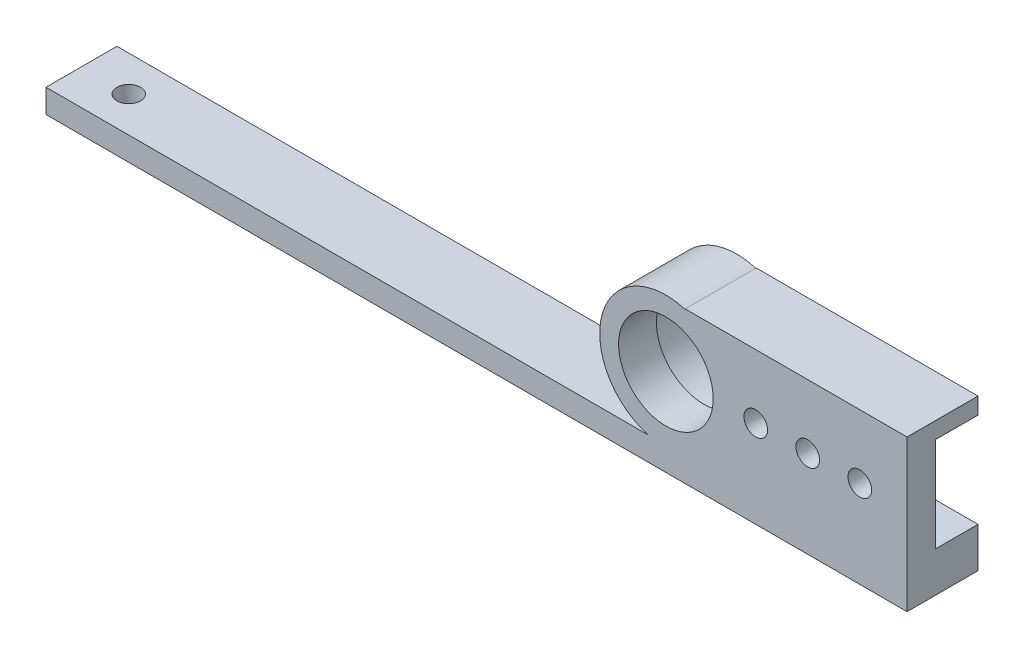
ISO-10303-21;
HEADER;
FILE_DESCRIPTION(('STEP AP214'),'2;1');
FILE_NAME('part.step','',(''),(''),'','','');
FILE_SCHEMA(('AUTOMOTIVE_DESIGN { 1 0 10303 214 1 1 1 1 }'));
ENDSEC;
DATA;
#1=APPLICATION_CONTEXT('core data for automotive mechanical design processes');
#2=APPLICATION_PROTOCOL_DEFINITION('international standard','automotive_design',2000,#1);
#3=PRODUCT_CONTEXT('',#1,'mechanical');
#4=PRODUCT('Part','Part','',(#3));
#5=PRODUCT_RELATED_PRODUCT_CATEGORY('part','',(#4));
#6=PRODUCT_DEFINITION_FORMATION('','',#4);
#7=PRODUCT_DEFINITION_CONTEXT('part definition',#1,'design');
#8=PRODUCT_DEFINITION('design','',#6,#7);
#9=PRODUCT_DEFINITION_SHAPE('','',#8);
#10=(LENGTH_UNIT() NAMED_UNIT(*) SI_UNIT(.MILLI.,.METRE.));
#11=(NAMED_UNIT(*) PLANE_ANGLE_UNIT() SI_UNIT($,.RADIAN.));
#12=(NAMED_UNIT(*) SI_UNIT($,.STERADIAN.) SOLID_ANGLE_UNIT());
#13=UNCERTAINTY_MEASURE_WITH_UNIT(LENGTH_MEASURE(1.E-05),#10,'distance_accuracy_value','');
#14=(GEOMETRIC_REPRESENTATION_CONTEXT(3) GLOBAL_UNCERTAINTY_ASSIGNED_CONTEXT((#13)) GLOBAL_UNIT_ASSIGNED_CONTEXT((#10,
#11,#12)) REPRESENTATION_CONTEXT('',''));
#15=CARTESIAN_POINT('',(0.,0.,0.));
#16=DIRECTION('',(0.,0.,1.));
#17=DIRECTION('',(1.,0.,0.));
#18=AXIS2_PLACEMENT_3D('',#15,#16,#17);
#19=CARTESIAN_POINT('',(-31.,0.,-9.));
#20=DIRECTION('',(0.,0.,1.));
#21=DIRECTION('',(1.,0.,0.));
#22=AXIS2_PLACEMENT_3D('',#19,#20,#21);
#23=CYLINDRICAL_SURFACE('',#22,14.);
#24=DIRECTION('',(0.,0.,1.));
#25=VECTOR('',#24,1.);
#26=CARTESIAN_POINT('',(-34.7080992435478,-13.5,-9.));
#27=LINE('',#26,#25);
#28=CARTESIAN_POINT('',(-34.7080992435478,-13.5,6.));
#29=VERTEX_POINT('',#28);
#30=CARTESIAN_POINT('',(-34.7080992435478,-13.5,-9.));
#31=VERTEX_POINT('',#30);
#32=EDGE_CURVE('E162',#29,#31,#27,.F.);
#33=ORIENTED_EDGE('',*,*,#32,.F.);
#34=CARTESIAN_POINT('',(-31.,0.,6.));
#35=DIRECTION('',(0.,0.,1.));
#36=DIRECTION('',(1.,0.,0.));
#37=AXIS2_PLACEMENT_3D('',#34,#35,#36);
#38=CIRCLE('',#37,14.);
#39=CARTESIAN_POINT('',(-26.8939671408107,13.3843376436512,6.));
#40=VERTEX_POINT('',#39);
#41=EDGE_CURVE('E181',#40,#29,#38,.T.);
#42=ORIENTED_EDGE('',*,*,#41,.F.);
#43=DIRECTION('',(0.,0.,1.));
#44=VECTOR('',#43,1.);
#45=CARTESIAN_POINT('',(-26.8939671408107,13.3843376436512,-9.));
#46=LINE('',#45,#44);
#47=CARTESIAN_POINT('',(-26.8939671408107,13.3843376436512,-9.));
#48=VERTEX_POINT('',#47);
#49=EDGE_CURVE('E226',#48,#40,#46,.T.);
#50=ORIENTED_EDGE('',*,*,#49,.F.);
#51=CARTESIAN_POINT('',(-31.,0.,-9.));
#52=DIRECTION('',(0.,0.,1.));
#53=DIRECTION('',(1.,0.,0.));
#54=AXIS2_PLACEMENT_3D('',#51,#52,#53);
#55=CIRCLE('',#54,14.);
#56=EDGE_CURVE('E197',#48,#31,#55,.T.);
#57=ORIENTED_EDGE('',*,*,#56,.T.);
#58=EDGE_LOOP('',(#33,#42,#50,#57));
#59=FACE_BOUND('',#58,.T.);
#60=ADVANCED_FACE('F45',(#59),#23,.T.);
#61=CARTESIAN_POINT('',(-31.,0.,-9.));
#62=DIRECTION('',(0.,0.,1.));
#63=DIRECTION('',(1.,0.,0.));
#64=AXIS2_PLACEMENT_3D('',#61,#62,#63);
#65=CYLINDRICAL_SURFACE('',#64,11.);
#66=CARTESIAN_POINT('',(-31.,0.,-9.));
#67=DIRECTION('',(0.,0.,1.));
#68=DIRECTION('',(1.,0.,0.));
#69=AXIS2_PLACEMENT_3D('',#66,#67,#68);
#70=CIRCLE('',#69,11.);
#71=CARTESIAN_POINT('',(-20.,0.,-9.));
#72=VERTEX_POINT('',#71);
#73=EDGE_CURVE('E177',#72,#72,#70,.T.);
#74=ORIENTED_EDGE('',*,*,#73,.F.);
#75=EDGE_LOOP('',(#74));
#76=FACE_BOUND('',#75,.T.);
#77=CARTESIAN_POINT('',(-31.,0.,-2.));
#78=DIRECTION('',(0.,0.,1.));
#79=DIRECTION('',(1.,0.,0.));
#80=AXIS2_PLACEMENT_3D('',#77,#78,#79);
#81=CIRCLE('',#80,11.);
#82=CARTESIAN_POINT('',(-20.,0.,-2.));
#83=VERTEX_POINT('',#82);
#84=EDGE_CURVE('E11',#83,#83,#81,.F.);
#85=ORIENTED_EDGE('',*,*,#84,.F.);
#86=EDGE_LOOP('',(#85));
#87=FACE_BOUND('',#86,.T.);
#88=ADVANCED_FACE('F323',(#76,#87),#65,.F.);
#89=CARTESIAN_POINT('',(20.,-10.,6.));
#90=DIRECTION('',(-1.,0.,0.));
#91=DIRECTION('',(0.,0.,1.));
#92=AXIS2_PLACEMENT_3D('',#89,#90,#91);
#93=PLANE('',#92);
#94=DIRECTION('',(0.,1.,0.));
#95=VECTOR('',#94,1.);
#96=CARTESIAN_POINT('',(20.,-10.,0.));
#97=LINE('',#96,#95);
#98=CARTESIAN_POINT('',(20.,-10.,0.));
#99=VERTEX_POINT('',#98);
#100=CARTESIAN_POINT('',(20.,10.,0.));
#101=VERTEX_POINT('',#100);
#102=EDGE_CURVE('E268',#99,#101,#97,.T.);
#103=ORIENTED_EDGE('',*,*,#102,.T.);
#104=DIRECTION('',(0.,0.,1.));
#105=VECTOR('',#104,1.);
#106=CARTESIAN_POINT('',(20.,10.,-9.));
#107=LINE('',#106,#105);
#108=CARTESIAN_POINT('',(20.,10.,-9.));
#109=VERTEX_POINT('',#108);
#110=EDGE_CURVE('E233',#109,#101,#107,.T.);
#111=ORIENTED_EDGE('',*,*,#110,.F.);
#112=DIRECTION('',(0.,-1.,0.));
#113=VECTOR('',#112,1.);
#114=CARTESIAN_POINT('',(20.,0.,-9.));
#115=LINE('',#114,#113);
#116=CARTESIAN_POINT('',(20.,13.5,-9.));
#117=VERTEX_POINT('',#116);
#118=EDGE_CURVE('E189',#117,#109,#115,.T.);
#119=ORIENTED_EDGE('',*,*,#118,.F.);
#120=DIRECTION('',(0.,0.,1.));
#121=VECTOR('',#120,1.);
#122=CARTESIAN_POINT('',(20.,13.5,-9.));
#123=LINE('',#122,#121);
#124=CARTESIAN_POINT('',(20.,13.5,6.));
#125=VERTEX_POINT('',#124);
#126=EDGE_CURVE('E230',#117,#125,#123,.T.);
#127=ORIENTED_EDGE('',*,*,#126,.T.);
#128=DIRECTION('',(0.,1.,0.));
#129=VECTOR('',#128,1.);
#130=CARTESIAN_POINT('',(20.,-10.,6.));
#131=LINE('',#130,#129);
#132=CARTESIAN_POINT('',(20.,-18.5,6.));
#133=VERTEX_POINT('',#132);
#134=EDGE_CURVE('E259',#133,#125,#131,.T.);
#135=ORIENTED_EDGE('',*,*,#134,.F.);
#136=DIRECTION('',(0.,0.,-1.));
#137=VECTOR('',#136,1.);
#138=CARTESIAN_POINT('',(20.,-18.5,-9.));
#139=LINE('',#138,#137);
#140=CARTESIAN_POINT('',(20.,-18.5,-9.));
#141=VERTEX_POINT('',#140);
#142=EDGE_CURVE('E155',#133,#141,#139,.T.);
#143=ORIENTED_EDGE('',*,*,#142,.T.);
#144=DIRECTION('',(0.,-1.,0.));
#145=VECTOR('',#144,1.);
#146=CARTESIAN_POINT('',(20.,0.,-9.));
#147=LINE('',#146,#145);
#148=CARTESIAN_POINT('',(20.,-10.,-9.));
#149=VERTEX_POINT('',#148);
#150=EDGE_CURVE('E200',#149,#141,#147,.T.);
#151=ORIENTED_EDGE('',*,*,#150,.F.);
#152=DIRECTION('',(0.,0.,1.));
#153=VECTOR('',#152,1.);
#154=CARTESIAN_POINT('',(20.,-10.,-9.));
#155=LINE('',#154,#153);
#156=EDGE_CURVE('E223',#149,#99,#155,.T.);
#157=ORIENTED_EDGE('',*,*,#156,.T.);
#158=EDGE_LOOP('',(#103,#111,#119,#127,#135,#143,#151,#157));
#159=FACE_BOUND('',#158,.T.);
#160=ADVANCED_FACE('F47',(#159),#93,.F.);
#161=CARTESIAN_POINT('',(0.,0.,6.));
#162=DIRECTION('',(0.,0.,1.));
#163=DIRECTION('',(1.,0.,0.));
#164=AXIS2_PLACEMENT_3D('',#161,#162,#163);
#165=PLANE('',#164);
#166=DIRECTION('',(0.,1.,0.));
#167=VECTOR('',#166,1.);
#168=CARTESIAN_POINT('',(-162.091344638161,0.,6.));
#169=LINE('',#168,#167);
#170=CARTESIAN_POINT('',(-162.091344638161,-18.5,6.));
#171=VERTEX_POINT('',#170);
#172=CARTESIAN_POINT('',(-162.091344638161,-13.5,6.));
#173=VERTEX_POINT('',#172);
#174=EDGE_CURVE('E142',#171,#173,#169,.T.);
#175=ORIENTED_EDGE('',*,*,#174,.F.);
#176=DIRECTION('',(1.,0.,0.));
#177=VECTOR('',#176,1.);
#178=CARTESIAN_POINT('',(-180.,-18.5,6.));
#179=LINE('',#178,#177);
#180=EDGE_CURVE('E152',#171,#133,#179,.T.);
#181=ORIENTED_EDGE('',*,*,#180,.T.);
#182=ORIENTED_EDGE('',*,*,#134,.T.);
#183=DIRECTION('',(-1.,0.,0.));
#184=VECTOR('',#183,1.);
#185=CARTESIAN_POINT('',(0.,13.5,6.));
#186=LINE('',#185,#184);
#187=CARTESIAN_POINT('',(-26.8939671408107,13.5,6.));
#188=VERTEX_POINT('',#187);
#189=EDGE_CURVE('E174',#125,#188,#186,.T.);
#190=ORIENTED_EDGE('',*,*,#189,.T.);
#191=DIRECTION('',(0.,1.,0.));
#192=VECTOR('',#191,1.);
#193=CARTESIAN_POINT('',(-26.8939671408107,0.,6.));
#194=LINE('',#193,#192);
#195=EDGE_CURVE('E212',#40,#188,#194,.T.);
#196=ORIENTED_EDGE('',*,*,#195,.F.);
#197=ORIENTED_EDGE('',*,*,#41,.T.);
#198=DIRECTION('',(1.,0.,0.));
#199=VECTOR('',#198,1.);
#200=CARTESIAN_POINT('',(-180.,-13.5,6.));
#201=LINE('',#200,#199);
#202=EDGE_CURVE('E68',#173,#29,#201,.T.);
#203=ORIENTED_EDGE('',*,*,#202,.F.);
#204=EDGE_LOOP('',(#175,#181,#182,#190,#196,#197,#203));
#205=FACE_BOUND('',#204,.T.);
#206=CARTESIAN_POINT('',(10.,0.,6.));
#207=DIRECTION('',(0.,0.,1.));
#208=DIRECTION('',(1.,0.,0.));
#209=AXIS2_PLACEMENT_3D('',#206,#207,#208);
#210=CIRCLE('',#209,2.5);
#211=CARTESIAN_POINT('',(12.5,0.,6.));
#212=VERTEX_POINT('',#211);
#213=EDGE_CURVE('E245',#212,#212,#210,.T.);
#214=ORIENTED_EDGE('',*,*,#213,.F.);
#215=EDGE_LOOP('',(#214));
#216=FACE_BOUND('',#215,.T.);
#217=CARTESIAN_POINT('',(-0.999999999999999,0.,6.));
#218=DIRECTION('',(0.,0.,1.));
#219=DIRECTION('',(1.,0.,0.));
#220=AXIS2_PLACEMENT_3D('',#217,#218,#219);
#221=CIRCLE('',#220,2.5);
#222=CARTESIAN_POINT('',(1.5,0.,6.));
#223=VERTEX_POINT('',#222);
#224=EDGE_CURVE('E248',#223,#223,#221,.T.);
#225=ORIENTED_EDGE('',*,*,#224,.F.);
#226=EDGE_LOOP('',(#225));
#227=FACE_BOUND('',#226,.T.);
#228=CARTESIAN_POINT('',(-12.,-1.53625178909098E-13,6.));
#229=DIRECTION('',(0.,0.,1.));
#230=DIRECTION('',(1.,0.,0.));
#231=AXIS2_PLACEMENT_3D('',#228,#229,#230);
#232=CIRCLE('',#231,2.5);
#233=CARTESIAN_POINT('',(-9.5,-1.53625178909098E-13,6.));
#234=VERTEX_POINT('',#233);
#235=EDGE_CURVE('E254',#234,#234,#232,.T.);
#236=ORIENTED_EDGE('',*,*,#235,.F.);
#237=EDGE_LOOP('',(#236));
#238=FACE_BOUND('',#237,.T.);
#239=CARTESIAN_POINT('',(-31.,0.,6.));
#240=DIRECTION('',(0.,0.,1.));
#241=DIRECTION('',(1.,0.,0.));
#242=AXIS2_PLACEMENT_3D('',#239,#240,#241);
#243=CIRCLE('',#242,10.);
#244=CARTESIAN_POINT('',(-21.,0.,6.));
#245=VERTEX_POINT('',#244);
#246=EDGE_CURVE('E170',#245,#245,#243,.T.);
#247=ORIENTED_EDGE('',*,*,#246,.F.);
#248=EDGE_LOOP('',(#247));
#249=FACE_BOUND('',#248,.T.);
#250=ADVANCED_FACE('F150',(#205,#216,#227,#238,#249),#165,.T.);
#251=CARTESIAN_POINT('',(0.,0.,0.));
#252=DIRECTION('',(0.,0.,1.));
#253=DIRECTION('',(1.,0.,0.));
#254=AXIS2_PLACEMENT_3D('',#251,#252,#253);
#255=PLANE('',#254);
#256=CARTESIAN_POINT('',(10.,0.,0.));
#257=DIRECTION('',(0.,0.,1.));
#258=DIRECTION('',(1.,0.,0.));
#259=AXIS2_PLACEMENT_3D('',#256,#257,#258);
#260=CIRCLE('',#259,2.5);
#261=CARTESIAN_POINT('',(12.5,0.,0.));
#262=VERTEX_POINT('',#261);
#263=EDGE_CURVE('E241',#262,#262,#260,.T.);
#264=ORIENTED_EDGE('',*,*,#263,.T.);
#265=EDGE_LOOP('',(#264));
#266=FACE_BOUND('',#265,.T.);
#267=CARTESIAN_POINT('',(-0.999999999999999,0.,0.));
#268=DIRECTION('',(0.,0.,1.));
#269=DIRECTION('',(1.,0.,0.));
#270=AXIS2_PLACEMENT_3D('',#267,#268,#269);
#271=CIRCLE('',#270,2.5);
#272=CARTESIAN_POINT('',(1.5,0.,0.));
#273=VERTEX_POINT('',#272);
#274=EDGE_CURVE('E251',#273,#273,#271,.T.);
#275=ORIENTED_EDGE('',*,*,#274,.T.);
#276=EDGE_LOOP('',(#275));
#277=FACE_BOUND('',#276,.T.);
#278=CARTESIAN_POINT('',(-12.,-1.53625178909098E-13,0.));
#279=DIRECTION('',(0.,0.,1.));
#280=DIRECTION('',(1.,0.,0.));
#281=AXIS2_PLACEMENT_3D('',#278,#279,#280);
#282=CIRCLE('',#281,2.5);
#283=CARTESIAN_POINT('',(-9.5,-1.53625178909098E-13,0.));
#284=VERTEX_POINT('',#283);
#285=EDGE_CURVE('E219',#284,#284,#282,.T.);
#286=ORIENTED_EDGE('',*,*,#285,.T.);
#287=EDGE_LOOP('',(#286));
#288=FACE_BOUND('',#287,.T.);
#289=DIRECTION('',(0.,-1.,0.));
#290=VECTOR('',#289,1.);
#291=CARTESIAN_POINT('',(-20.,-10.,0.));
#292=LINE('',#291,#290);
#293=CARTESIAN_POINT('',(-20.,-8.66025403784439,0.));
#294=VERTEX_POINT('',#293);
#295=CARTESIAN_POINT('',(-20.,-10.,0.));
#296=VERTEX_POINT('',#295);
#297=EDGE_CURVE('E244',#294,#296,#292,.T.);
#298=ORIENTED_EDGE('',*,*,#297,.F.);
#299=CARTESIAN_POINT('',(-31.,0.,0.));
#300=DIRECTION('',(0.,0.,1.));
#301=DIRECTION('',(1.,0.,0.));
#302=AXIS2_PLACEMENT_3D('',#299,#300,#301);
#303=CIRCLE('',#302,14.);
#304=CARTESIAN_POINT('',(-20.,8.66025403784439,0.));
#305=VERTEX_POINT('',#304);
#306=EDGE_CURVE('E53',#294,#305,#303,.T.);
#307=ORIENTED_EDGE('',*,*,#306,.T.);
#308=CARTESIAN_POINT('',(-20.,10.,0.));
#309=VERTEX_POINT('',#308);
#310=EDGE_CURVE('E262',#309,#305,#292,.T.);
#311=ORIENTED_EDGE('',*,*,#310,.F.);
#312=DIRECTION('',(-1.,0.,0.));
#313=VECTOR('',#312,1.);
#314=CARTESIAN_POINT('',(20.,10.,0.));
#315=LINE('',#314,#313);
#316=EDGE_CURVE('E261',#101,#309,#315,.T.);
#317=ORIENTED_EDGE('',*,*,#316,.F.);
#318=ORIENTED_EDGE('',*,*,#102,.F.);
#319=DIRECTION('',(1.,0.,0.));
#320=VECTOR('',#319,1.);
#321=CARTESIAN_POINT('',(20.,-10.,0.));
#322=LINE('',#321,#320);
#323=EDGE_CURVE('E265',#296,#99,#322,.T.);
#324=ORIENTED_EDGE('',*,*,#323,.F.);
#325=EDGE_LOOP('',(#298,#307,#311,#317,#318,#324));
#326=FACE_BOUND('',#325,.T.);
#327=ADVANCED_FACE('F273',(#266,#277,#288,#326),#255,.F.);
#328=CARTESIAN_POINT('',(-12.,-1.53625178909098E-13,0.));
#329=DIRECTION('',(0.,0.,1.));
#330=DIRECTION('',(1.,0.,0.));
#331=AXIS2_PLACEMENT_3D('',#328,#329,#330);
#332=CYLINDRICAL_SURFACE('',#331,2.5);
#333=ORIENTED_EDGE('',*,*,#285,.F.);
#334=EDGE_LOOP('',(#333));
#335=FACE_BOUND('',#334,.T.);
#336=ORIENTED_EDGE('',*,*,#235,.T.);
#337=EDGE_LOOP('',(#336));
#338=FACE_BOUND('',#337,.T.);
#339=ADVANCED_FACE('F491',(#335,#338),#332,.F.);
#340=CARTESIAN_POINT('',(-0.999999999999999,0.,0.));
#341=DIRECTION('',(0.,0.,1.));
#342=DIRECTION('',(1.,0.,0.));
#343=AXIS2_PLACEMENT_3D('',#340,#341,#342);
#344=CYLINDRICAL_SURFACE('',#343,2.5);
#345=ORIENTED_EDGE('',*,*,#274,.F.);
#346=EDGE_LOOP('',(#345));
#347=FACE_BOUND('',#346,.T.);
#348=ORIENTED_EDGE('',*,*,#224,.T.);
#349=EDGE_LOOP('',(#348));
#350=FACE_BOUND('',#349,.T.);
#351=ADVANCED_FACE('F503',(#347,#350),#344,.F.);
#352=CARTESIAN_POINT('',(10.,0.,0.));
#353=DIRECTION('',(0.,0.,1.));
#354=DIRECTION('',(1.,0.,0.));
#355=AXIS2_PLACEMENT_3D('',#352,#353,#354);
#356=CYLINDRICAL_SURFACE('',#355,2.5);
#357=ORIENTED_EDGE('',*,*,#263,.F.);
#358=EDGE_LOOP('',(#357));
#359=FACE_BOUND('',#358,.T.);
#360=ORIENTED_EDGE('',*,*,#213,.T.);
#361=EDGE_LOOP('',(#360));
#362=FACE_BOUND('',#361,.T.);
#363=ADVANCED_FACE('F480',(#359,#362),#356,.F.);
#364=CARTESIAN_POINT('',(-31.,0.,-9.));
#365=DIRECTION('',(0.,0.,1.));
#366=DIRECTION('',(1.,0.,0.));
#367=AXIS2_PLACEMENT_3D('',#364,#365,#366);
#368=CYLINDRICAL_SURFACE('',#367,14.);
#369=ORIENTED_EDGE('',*,*,#306,.F.);
#370=DIRECTION('',(0.,0.,1.));
#371=VECTOR('',#370,1.);
#372=CARTESIAN_POINT('',(-20.,-8.66025403784439,-9.));
#373=LINE('',#372,#371);
#374=CARTESIAN_POINT('',(-20.,-8.66025403784439,-9.));
#375=VERTEX_POINT('',#374);
#376=EDGE_CURVE('E216',#375,#294,#373,.T.);
#377=ORIENTED_EDGE('',*,*,#376,.F.);
#378=CARTESIAN_POINT('',(-31.,0.,-9.));
#379=DIRECTION('',(0.,0.,1.));
#380=DIRECTION('',(1.,0.,0.));
#381=AXIS2_PLACEMENT_3D('',#378,#379,#380);
#382=CIRCLE('',#381,14.);
#383=CARTESIAN_POINT('',(-20.,8.66025403784439,-9.));
#384=VERTEX_POINT('',#383);
#385=EDGE_CURVE('E180',#375,#384,#382,.T.);
#386=ORIENTED_EDGE('',*,*,#385,.T.);
#387=DIRECTION('',(0.,0.,1.));
#388=VECTOR('',#387,1.);
#389=CARTESIAN_POINT('',(-20.,8.66025403784439,-9.));
#390=LINE('',#389,#388);
#391=EDGE_CURVE('E209',#384,#305,#390,.T.);
#392=ORIENTED_EDGE('',*,*,#391,.T.);
#393=EDGE_LOOP('',(#369,#377,#386,#392));
#394=FACE_BOUND('',#393,.T.);
#395=ADVANCED_FACE('F281',(#394),#368,.T.);
#396=CARTESIAN_POINT('',(-20.,0.,-9.));
#397=DIRECTION('',(-1.,0.,0.));
#398=DIRECTION('',(0.,0.,1.));
#399=AXIS2_PLACEMENT_3D('',#396,#397,#398);
#400=PLANE('',#399);
#401=ORIENTED_EDGE('',*,*,#376,.T.);
#402=ORIENTED_EDGE('',*,*,#297,.T.);
#403=DIRECTION('',(0.,0.,1.));
#404=VECTOR('',#403,1.);
#405=CARTESIAN_POINT('',(-20.,-10.,-9.));
#406=LINE('',#405,#404);
#407=CARTESIAN_POINT('',(-20.,-10.,-9.));
#408=VERTEX_POINT('',#407);
#409=EDGE_CURVE('E220',#408,#296,#406,.T.);
#410=ORIENTED_EDGE('',*,*,#409,.F.);
#411=DIRECTION('',(0.,-1.,0.));
#412=VECTOR('',#411,1.);
#413=CARTESIAN_POINT('',(-20.,0.,-9.));
#414=LINE('',#413,#412);
#415=EDGE_CURVE('E206',#375,#408,#414,.T.);
#416=ORIENTED_EDGE('',*,*,#415,.F.);
#417=EDGE_LOOP('',(#401,#402,#410,#416));
#418=FACE_BOUND('',#417,.T.);
#419=ADVANCED_FACE('F335',(#418),#400,.F.);
#420=CARTESIAN_POINT('',(0.,-10.,-9.));
#421=DIRECTION('',(0.,-1.,0.));
#422=DIRECTION('',(1.,0.,0.));
#423=AXIS2_PLACEMENT_3D('',#420,#421,#422);
#424=PLANE('',#423);
#425=ORIENTED_EDGE('',*,*,#409,.T.);
#426=ORIENTED_EDGE('',*,*,#323,.T.);
#427=ORIENTED_EDGE('',*,*,#156,.F.);
#428=DIRECTION('',(1.,0.,0.));
#429=VECTOR('',#428,1.);
#430=CARTESIAN_POINT('',(0.,-10.,-9.));
#431=LINE('',#430,#429);
#432=EDGE_CURVE('E203',#408,#149,#431,.T.);
#433=ORIENTED_EDGE('',*,*,#432,.F.);
#434=EDGE_LOOP('',(#425,#426,#427,#433));
#435=FACE_BOUND('',#434,.T.);
#436=ADVANCED_FACE('F295',(#435),#424,.F.);
#437=CARTESIAN_POINT('',(0.,10.,-9.));
#438=DIRECTION('',(0.,1.,0.));
#439=DIRECTION('',(-1.,0.,0.));
#440=AXIS2_PLACEMENT_3D('',#437,#438,#439);
#441=PLANE('',#440);
#442=ORIENTED_EDGE('',*,*,#110,.T.);
#443=ORIENTED_EDGE('',*,*,#316,.T.);
#444=DIRECTION('',(0.,0.,1.));
#445=VECTOR('',#444,1.);
#446=CARTESIAN_POINT('',(-20.,10.,-9.));
#447=LINE('',#446,#445);
#448=CARTESIAN_POINT('',(-20.,10.,-9.));
#449=VERTEX_POINT('',#448);
#450=EDGE_CURVE('E236',#449,#309,#447,.T.);
#451=ORIENTED_EDGE('',*,*,#450,.F.);
#452=DIRECTION('',(-1.,0.,0.));
#453=VECTOR('',#452,1.);
#454=CARTESIAN_POINT('',(0.,10.,-9.));
#455=LINE('',#454,#453);
#456=EDGE_CURVE('E186',#109,#449,#455,.T.);
#457=ORIENTED_EDGE('',*,*,#456,.F.);
#458=EDGE_LOOP('',(#442,#443,#451,#457));
#459=FACE_BOUND('',#458,.T.);
#460=ADVANCED_FACE('F291',(#459),#441,.F.);
#461=CARTESIAN_POINT('',(-20.,0.,-9.));
#462=DIRECTION('',(-1.,0.,0.));
#463=DIRECTION('',(0.,0.,1.));
#464=AXIS2_PLACEMENT_3D('',#461,#462,#463);
#465=PLANE('',#464);
#466=ORIENTED_EDGE('',*,*,#450,.T.);
#467=ORIENTED_EDGE('',*,*,#310,.T.);
#468=ORIENTED_EDGE('',*,*,#391,.F.);
#469=DIRECTION('',(0.,-1.,0.));
#470=VECTOR('',#469,1.);
#471=CARTESIAN_POINT('',(-20.,0.,-9.));
#472=LINE('',#471,#470);
#473=EDGE_CURVE('E184',#449,#384,#472,.T.);
#474=ORIENTED_EDGE('',*,*,#473,.F.);
#475=EDGE_LOOP('',(#466,#467,#468,#474));
#476=FACE_BOUND('',#475,.T.);
#477=ADVANCED_FACE('F279',(#476),#465,.F.);
#478=CARTESIAN_POINT('',(-26.8939671408107,0.,-9.));
#479=DIRECTION('',(1.,0.,0.));
#480=DIRECTION('',(0.,0.,-1.));
#481=AXIS2_PLACEMENT_3D('',#478,#479,#480);
#482=PLANE('',#481);
#483=ORIENTED_EDGE('',*,*,#195,.T.);
#484=DIRECTION('',(0.,0.,1.));
#485=VECTOR('',#484,1.);
#486=CARTESIAN_POINT('',(-26.8939671408107,13.5,-9.));
#487=LINE('',#486,#485);
#488=CARTESIAN_POINT('',(-26.8939671408107,13.5,-9.));
#489=VERTEX_POINT('',#488);
#490=EDGE_CURVE('E228',#489,#188,#487,.T.);
#491=ORIENTED_EDGE('',*,*,#490,.F.);
#492=DIRECTION('',(0.,1.,0.));
#493=VECTOR('',#492,1.);
#494=CARTESIAN_POINT('',(-26.8939671408107,0.,-9.));
#495=LINE('',#494,#493);
#496=EDGE_CURVE('E195',#48,#489,#495,.T.);
#497=ORIENTED_EDGE('',*,*,#496,.F.);
#498=ORIENTED_EDGE('',*,*,#49,.T.);
#499=EDGE_LOOP('',(#483,#491,#497,#498));
#500=FACE_BOUND('',#499,.T.);
#501=ADVANCED_FACE('F306',(#500),#482,.F.);
#502=CARTESIAN_POINT('',(0.,13.5,-9.));
#503=DIRECTION('',(0.,1.,0.));
#504=DIRECTION('',(-1.,0.,0.));
#505=AXIS2_PLACEMENT_3D('',#502,#503,#504);
#506=PLANE('',#505);
#507=ORIENTED_EDGE('',*,*,#189,.F.);
#508=ORIENTED_EDGE('',*,*,#126,.F.);
#509=DIRECTION('',(-1.,0.,0.));
#510=VECTOR('',#509,1.);
#511=CARTESIAN_POINT('',(0.,13.5,-9.));
#512=LINE('',#511,#510);
#513=EDGE_CURVE('E192',#117,#489,#512,.T.);
#514=ORIENTED_EDGE('',*,*,#513,.T.);
#515=ORIENTED_EDGE('',*,*,#490,.T.);
#516=EDGE_LOOP('',(#507,#508,#514,#515));
#517=FACE_BOUND('',#516,.T.);
#518=ADVANCED_FACE('F309',(#517),#506,.T.);
#519=CARTESIAN_POINT('',(0.,0.,-9.));
#520=DIRECTION('',(0.,0.,1.));
#521=DIRECTION('',(1.,0.,0.));
#522=AXIS2_PLACEMENT_3D('',#519,#520,#521);
#523=PLANE('',#522);
#524=ORIENTED_EDGE('',*,*,#73,.T.);
#525=EDGE_LOOP('',(#524));
#526=FACE_BOUND('',#525,.T.);
#527=DIRECTION('',(1.,0.,0.));
#528=VECTOR('',#527,1.);
#529=CARTESIAN_POINT('',(-180.,-18.5,-9.));
#530=LINE('',#529,#528);
#531=CARTESIAN_POINT('',(-162.091344638161,-18.5,-9.));
#532=VERTEX_POINT('',#531);
#533=EDGE_CURVE('E160',#532,#141,#530,.T.);
#534=ORIENTED_EDGE('',*,*,#533,.F.);
#535=DIRECTION('',(0.,1.,0.));
#536=VECTOR('',#535,1.);
#537=CARTESIAN_POINT('',(-162.091344638161,0.,-9.));
#538=LINE('',#537,#536);
#539=CARTESIAN_POINT('',(-162.091344638161,-13.5,-9.));
#540=VERTEX_POINT('',#539);
#541=EDGE_CURVE('E60',#532,#540,#538,.T.);
#542=ORIENTED_EDGE('',*,*,#541,.T.);
#543=DIRECTION('',(1.,0.,0.));
#544=VECTOR('',#543,1.);
#545=CARTESIAN_POINT('',(-180.,-13.5,-9.));
#546=LINE('',#545,#544);
#547=EDGE_CURVE('E164',#540,#31,#546,.T.);
#548=ORIENTED_EDGE('',*,*,#547,.T.);
#549=ORIENTED_EDGE('',*,*,#56,.F.);
#550=ORIENTED_EDGE('',*,*,#496,.T.);
#551=ORIENTED_EDGE('',*,*,#513,.F.);
#552=ORIENTED_EDGE('',*,*,#118,.T.);
#553=ORIENTED_EDGE('',*,*,#456,.T.);
#554=ORIENTED_EDGE('',*,*,#473,.T.);
#555=ORIENTED_EDGE('',*,*,#385,.F.);
#556=ORIENTED_EDGE('',*,*,#415,.T.);
#557=ORIENTED_EDGE('',*,*,#432,.T.);
#558=ORIENTED_EDGE('',*,*,#150,.T.);
#559=EDGE_LOOP('',(#534,#542,#548,#549,#550,#551,#552,#553,#554,#555,#556,#557,#558));
#560=FACE_BOUND('',#559,.T.);
#561=ADVANCED_FACE('F285',(#526,#560),#523,.F.);
#562=CARTESIAN_POINT('',(-31.,0.,-2.));
#563=DIRECTION('',(0.,0.,1.));
#564=DIRECTION('',(1.,0.,0.));
#565=AXIS2_PLACEMENT_3D('',#562,#563,#564);
#566=PLANE('',#565);
#567=CARTESIAN_POINT('',(-31.,0.,-2.));
#568=DIRECTION('',(0.,0.,1.));
#569=DIRECTION('',(1.,0.,0.));
#570=AXIS2_PLACEMENT_3D('',#567,#568,#569);
#571=CIRCLE('',#570,10.);
#572=CARTESIAN_POINT('',(-21.,0.,-2.));
#573=VERTEX_POINT('',#572);
#574=EDGE_CURVE('E171',#573,#573,#571,.T.);
#575=ORIENTED_EDGE('',*,*,#574,.T.);
#576=EDGE_LOOP('',(#575));
#577=FACE_BOUND('',#576,.T.);
#578=ORIENTED_EDGE('',*,*,#84,.T.);
#579=EDGE_LOOP('',(#578));
#580=FACE_BOUND('',#579,.T.);
#581=ADVANCED_FACE('F317',(#577,#580),#566,.F.);
#582=CARTESIAN_POINT('',(-31.,0.,-2.));
#583=DIRECTION('',(0.,0.,1.));
#584=DIRECTION('',(1.,0.,0.));
#585=AXIS2_PLACEMENT_3D('',#582,#583,#584);
#586=CYLINDRICAL_SURFACE('',#585,10.);
#587=ORIENTED_EDGE('',*,*,#574,.F.);
#588=EDGE_LOOP('',(#587));
#589=FACE_BOUND('',#588,.T.);
#590=ORIENTED_EDGE('',*,*,#246,.T.);
#591=EDGE_LOOP('',(#590));
#592=FACE_BOUND('',#591,.T.);
#593=ADVANCED_FACE('F340',(#589,#592),#586,.F.);
#594=CARTESIAN_POINT('',(-180.,-13.5,-9.));
#595=DIRECTION('',(0.,1.,0.));
#596=DIRECTION('',(0.,0.,1.));
#597=AXIS2_PLACEMENT_3D('',#594,#595,#596);
#598=PLANE('',#597);
#599=CARTESIAN_POINT('',(-152.091344638161,-13.5,-1.5));
#600=DIRECTION('',(0.,1.,0.));
#601=DIRECTION('',(0.,0.,1.));
#602=AXIS2_PLACEMENT_3D('',#599,#600,#601);
#603=CIRCLE('',#602,2.5);
#604=CARTESIAN_POINT('',(-152.091344638161,-13.5,0.999999999999996));
#605=VERTEX_POINT('',#604);
#606=EDGE_CURVE('E147',#605,#605,#603,.T.);
#607=ORIENTED_EDGE('',*,*,#606,.F.);
#608=EDGE_LOOP('',(#607));
#609=FACE_BOUND('',#608,.T.);
#610=DIRECTION('',(0.,0.,-1.));
#611=VECTOR('',#610,1.);
#612=CARTESIAN_POINT('',(-162.091344638161,-13.5,-9.));
#613=LINE('',#612,#611);
#614=EDGE_CURVE('E146',#173,#540,#613,.T.);
#615=ORIENTED_EDGE('',*,*,#614,.F.);
#616=ORIENTED_EDGE('',*,*,#202,.T.);
#617=ORIENTED_EDGE('',*,*,#32,.T.);
#618=ORIENTED_EDGE('',*,*,#547,.F.);
#619=EDGE_LOOP('',(#615,#616,#617,#618));
#620=FACE_BOUND('',#619,.T.);
#621=ADVANCED_FACE('F299',(#609,#620),#598,.T.);
#622=CARTESIAN_POINT('',(-180.,-18.5,-9.));
#623=DIRECTION('',(0.,-1.,0.));
#624=DIRECTION('',(0.,0.,-1.));
#625=AXIS2_PLACEMENT_3D('',#622,#623,#624);
#626=PLANE('',#625);
#627=CARTESIAN_POINT('',(-152.091344638161,-18.5,-1.5));
#628=DIRECTION('',(0.,-1.,0.));
#629=DIRECTION('',(0.,0.,-1.));
#630=AXIS2_PLACEMENT_3D('',#627,#628,#629);
#631=CIRCLE('',#630,2.5);
#632=CARTESIAN_POINT('',(-152.091344638161,-18.5,-3.99999999999999));
#633=VERTEX_POINT('',#632);
#634=EDGE_CURVE('E363',#633,#633,#631,.T.);
#635=ORIENTED_EDGE('',*,*,#634,.F.);
#636=EDGE_LOOP('',(#635));
#637=FACE_BOUND('',#636,.T.);
#638=DIRECTION('',(0.,0.,1.));
#639=VECTOR('',#638,1.);
#640=CARTESIAN_POINT('',(-162.091344638161,-18.5,-38.9946695906237));
#641=LINE('',#640,#639);
#642=EDGE_CURVE('E139',#532,#171,#641,.T.);
#643=ORIENTED_EDGE('',*,*,#642,.F.);
#644=ORIENTED_EDGE('',*,*,#533,.T.);
#645=ORIENTED_EDGE('',*,*,#142,.F.);
#646=ORIENTED_EDGE('',*,*,#180,.F.);
#647=EDGE_LOOP('',(#643,#644,#645,#646));
#648=FACE_BOUND('',#647,.T.);
#649=ADVANCED_FACE('F158',(#637,#648),#626,.T.);
#650=CARTESIAN_POINT('',(-162.091344638161,14.,-38.9946695906237));
#651=DIRECTION('',(1.,0.,0.));
#652=DIRECTION('',(0.,0.,-1.));
#653=AXIS2_PLACEMENT_3D('',#650,#651,#652);
#654=PLANE('',#653);
#655=ORIENTED_EDGE('',*,*,#174,.T.);
#656=ORIENTED_EDGE('',*,*,#614,.T.);
#657=ORIENTED_EDGE('',*,*,#541,.F.);
#658=ORIENTED_EDGE('',*,*,#642,.T.);
#659=EDGE_LOOP('',(#655,#656,#657,#658));
#660=FACE_BOUND('',#659,.T.);
#661=ADVANCED_FACE('F141',(#660),#654,.F.);
#662=CARTESIAN_POINT('',(-152.091344638161,14.,-1.5));
#663=DIRECTION('',(0.,-1.,0.));
#664=DIRECTION('',(0.,0.,-1.));
#665=AXIS2_PLACEMENT_3D('',#662,#663,#664);
#666=CYLINDRICAL_SURFACE('',#665,2.5);
#667=ORIENTED_EDGE('',*,*,#606,.T.);
#668=EDGE_LOOP('',(#667));
#669=FACE_BOUND('',#668,.T.);
#670=ORIENTED_EDGE('',*,*,#634,.T.);
#671=EDGE_LOOP('',(#670));
#672=FACE_BOUND('',#671,.T.);
#673=ADVANCED_FACE('F353',(#669,#672),#666,.F.);
#674=CLOSED_SHELL('',(#60,#88,#160,#250,#327,#339,#351,#363,#395,#419,#436,#460,#477,#501,#518,
#561,#581,#593,#621,#649,#661,#673));
#675=MANIFOLD_SOLID_BREP('B2',#674);
#676=ADVANCED_BREP_SHAPE_REPRESENTATION('',(#18,#675),#14);
#677=SHAPE_DEFINITION_REPRESENTATION(#9,#676);
ENDSEC;
END-ISO-10303-21;
